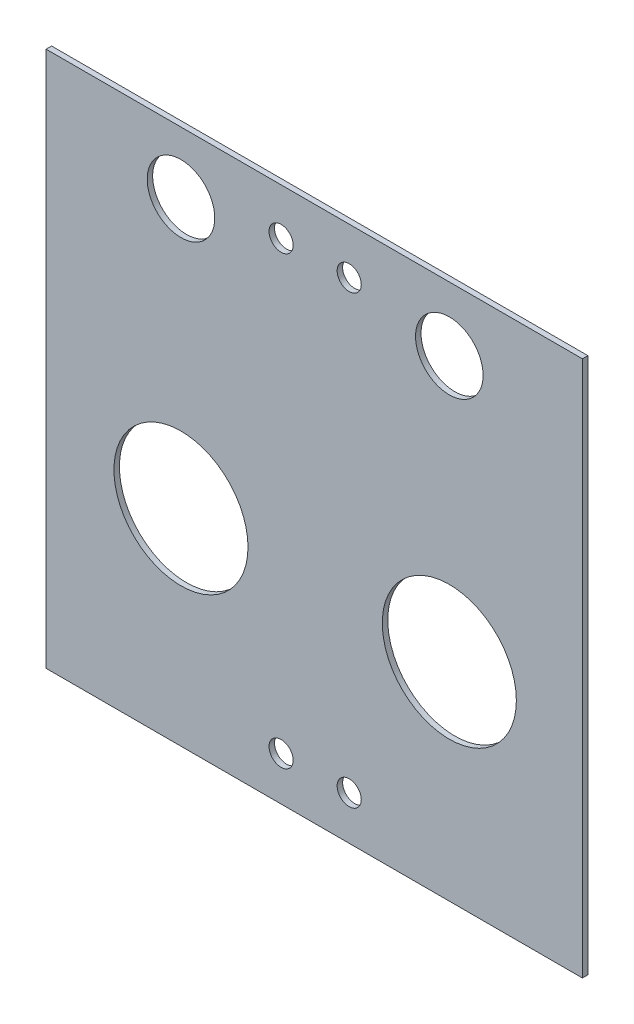
ISO-10303-21;
HEADER;
FILE_DESCRIPTION(('STEP AP214'),'2;1');
FILE_NAME('part.step','',(''),(''),'','','');
FILE_SCHEMA(('AUTOMOTIVE_DESIGN { 1 0 10303 214 1 1 1 1 }'));
ENDSEC;
DATA;
#1=APPLICATION_CONTEXT('core data for automotive mechanical design processes');
#2=APPLICATION_PROTOCOL_DEFINITION('international standard','automotive_design',2000,#1);
#3=PRODUCT_CONTEXT('',#1,'mechanical');
#4=PRODUCT('Part','Part','',(#3));
#5=PRODUCT_RELATED_PRODUCT_CATEGORY('part','',(#4));
#6=PRODUCT_DEFINITION_FORMATION('','',#4);
#7=PRODUCT_DEFINITION_CONTEXT('part definition',#1,'design');
#8=PRODUCT_DEFINITION('design','',#6,#7);
#9=PRODUCT_DEFINITION_SHAPE('','',#8);
#10=(LENGTH_UNIT() NAMED_UNIT(*) SI_UNIT(.MILLI.,.METRE.));
#11=(NAMED_UNIT(*) PLANE_ANGLE_UNIT() SI_UNIT($,.RADIAN.));
#12=(NAMED_UNIT(*) SI_UNIT($,.STERADIAN.) SOLID_ANGLE_UNIT());
#13=UNCERTAINTY_MEASURE_WITH_UNIT(LENGTH_MEASURE(1.E-05),#10,'distance_accuracy_value','');
#14=(GEOMETRIC_REPRESENTATION_CONTEXT(3) GLOBAL_UNCERTAINTY_ASSIGNED_CONTEXT((#13)) GLOBAL_UNIT_ASSIGNED_CONTEXT((#10,
#11,#12)) REPRESENTATION_CONTEXT('',''));
#15=CARTESIAN_POINT('',(0.,0.,0.));
#16=DIRECTION('',(0.,0.,1.));
#17=DIRECTION('',(1.,0.,0.));
#18=AXIS2_PLACEMENT_3D('',#15,#16,#17);
#19=CARTESIAN_POINT('',(127.71099853515,85.258003234863,-0.41148));
#20=DIRECTION('',(0.,0.,1.));
#21=DIRECTION('',(1.,0.,0.));
#22=AXIS2_PLACEMENT_3D('',#19,#20,#21);
#23=PLANE('',#22);
#24=CARTESIAN_POINT('',(142.74800109863,102.87000274658,-0.41148));
#25=DIRECTION('',(0.,0.,1.));
#26=DIRECTION('',(1.,0.,0.));
#27=AXIS2_PLACEMENT_3D('',#24,#25,#26);
#28=CIRCLE('',#27,1.259999990463);
#29=CARTESIAN_POINT('',(144.00800108909,102.87000274658,-0.41148));
#30=VERTEX_POINT('',#29);
#31=EDGE_CURVE('P0_E48',#30,#30,#28,.T.);
#32=ORIENTED_EDGE('',*,*,#31,.T.);
#33=EDGE_LOOP('',(#32));
#34=FACE_BOUND('',#33,.T.);
#35=CARTESIAN_POINT('',(139.014,103.53,-0.41148));
#36=DIRECTION('',(0.,0.,1.));
#37=DIRECTION('',(1.,0.,0.));
#38=AXIS2_PLACEMENT_3D('',#35,#36,#37);
#39=CIRCLE('',#38,0.45);
#40=CARTESIAN_POINT('',(139.464,103.53,-0.41148));
#41=VERTEX_POINT('',#40);
#42=EDGE_CURVE('P0_E177',#41,#41,#39,.T.);
#43=ORIENTED_EDGE('',*,*,#42,.T.);
#44=EDGE_LOOP('',(#43));
#45=FACE_BOUND('',#44,.T.);
#46=CARTESIAN_POINT('',(142.74800109863,92.988998413086,-0.41148));
#47=DIRECTION('',(0.,0.,1.));
#48=DIRECTION('',(1.,0.,0.));
#49=AXIS2_PLACEMENT_3D('',#46,#47,#48);
#50=CIRCLE('',#49,2.5);
#51=CARTESIAN_POINT('',(145.24800109863,92.988998413086,-0.41148));
#52=VERTEX_POINT('',#51);
#53=EDGE_CURVE('P0_E186',#52,#52,#50,.T.);
#54=ORIENTED_EDGE('',*,*,#53,.T.);
#55=EDGE_LOOP('',(#54));
#56=FACE_BOUND('',#55,.T.);
#57=CARTESIAN_POINT('',(139.014,86.893,-0.41148));
#58=DIRECTION('',(0.,0.,1.));
#59=DIRECTION('',(1.,0.,0.));
#60=AXIS2_PLACEMENT_3D('',#57,#58,#59);
#61=CIRCLE('',#60,0.45);
#62=CARTESIAN_POINT('',(139.464,86.893,-0.41148));
#63=VERTEX_POINT('',#62);
#64=EDGE_CURVE('P0_E158',#63,#63,#61,.T.);
#65=ORIENTED_EDGE('',*,*,#64,.T.);
#66=EDGE_LOOP('',(#65));
#67=FACE_BOUND('',#66,.T.);
#68=CARTESIAN_POINT('',(136.474,103.53,-0.41148));
#69=DIRECTION('',(0.,0.,1.));
#70=DIRECTION('',(1.,0.,0.));
#71=AXIS2_PLACEMENT_3D('',#68,#69,#70);
#72=CIRCLE('',#71,0.45);
#73=CARTESIAN_POINT('',(136.924,103.53,-0.41148));
#74=VERTEX_POINT('',#73);
#75=EDGE_CURVE('P0_E159',#74,#74,#72,.T.);
#76=ORIENTED_EDGE('',*,*,#75,.T.);
#77=EDGE_LOOP('',(#76));
#78=FACE_BOUND('',#77,.T.);
#79=CARTESIAN_POINT('',(132.74000549316,102.9459991455,-0.41148));
#80=DIRECTION('',(0.,0.,1.));
#81=DIRECTION('',(1.,0.,0.));
#82=AXIS2_PLACEMENT_3D('',#79,#80,#81);
#83=CIRCLE('',#82,1.259999990463);
#84=CARTESIAN_POINT('',(134.00000548362,102.9459991455,-0.41148));
#85=VERTEX_POINT('',#84);
#86=EDGE_CURVE('P0_E154',#85,#85,#83,.T.);
#87=ORIENTED_EDGE('',*,*,#86,.T.);
#88=EDGE_LOOP('',(#87));
#89=FACE_BOUND('',#88,.T.);
#90=CARTESIAN_POINT('',(136.474,86.893,-0.41148));
#91=DIRECTION('',(0.,0.,1.));
#92=DIRECTION('',(1.,0.,0.));
#93=AXIS2_PLACEMENT_3D('',#90,#91,#92);
#94=CIRCLE('',#93,0.45);
#95=CARTESIAN_POINT('',(136.924,86.893,-0.41148));
#96=VERTEX_POINT('',#95);
#97=EDGE_CURVE('P0_E184',#96,#96,#94,.T.);
#98=ORIENTED_EDGE('',*,*,#97,.T.);
#99=EDGE_LOOP('',(#98));
#100=FACE_BOUND('',#99,.T.);
#101=CARTESIAN_POINT('',(132.74000549316,92.939002990723,-0.41148));
#102=DIRECTION('',(0.,0.,1.));
#103=DIRECTION('',(1.,0.,0.));
#104=AXIS2_PLACEMENT_3D('',#101,#102,#103);
#105=CIRCLE('',#104,2.5);
#106=CARTESIAN_POINT('',(135.24000549316,92.939002990723,-0.41148));
#107=VERTEX_POINT('',#106);
#108=EDGE_CURVE('P0_E200',#107,#107,#105,.T.);
#109=ORIENTED_EDGE('',*,*,#108,.T.);
#110=EDGE_LOOP('',(#109));
#111=FACE_BOUND('',#110,.T.);
#112=DIRECTION('',(0.,1.,0.));
#113=VECTOR('',#112,1.);
#114=CARTESIAN_POINT('',(127.71099853515,85.258003234863,-0.41148));
#115=LINE('',#114,#113);
#116=CARTESIAN_POINT('',(127.71099853515,85.258003234863,-0.41148));
#117=VERTEX_POINT('',#116);
#118=CARTESIAN_POINT('',(127.71099853515,105.25800323486,-0.41148));
#119=VERTEX_POINT('',#118);
#120=EDGE_CURVE('P0_E148',#117,#119,#115,.T.);
#121=ORIENTED_EDGE('',*,*,#120,.T.);
#122=DIRECTION('',(1.,0.,0.));
#123=VECTOR('',#122,1.);
#124=CARTESIAN_POINT('',(127.71099853515,105.25800323486,-0.41148));
#125=LINE('',#124,#123);
#126=CARTESIAN_POINT('',(147.71099853515,105.25800323486,-0.41148));
#127=VERTEX_POINT('',#126);
#128=EDGE_CURVE('P0_E194',#119,#127,#125,.T.);
#129=ORIENTED_EDGE('',*,*,#128,.T.);
#130=DIRECTION('',(0.,-1.,0.));
#131=VECTOR('',#130,1.);
#132=CARTESIAN_POINT('',(147.71099853515,105.25800323486,-0.41148));
#133=LINE('',#132,#131);
#134=CARTESIAN_POINT('',(147.71099853515,85.258003234863,-0.41148));
#135=VERTEX_POINT('',#134);
#136=EDGE_CURVE('P0_E181',#127,#135,#133,.T.);
#137=ORIENTED_EDGE('',*,*,#136,.T.);
#138=DIRECTION('',(-1.,0.,0.));
#139=VECTOR('',#138,1.);
#140=CARTESIAN_POINT('',(147.71099853515,85.258003234863,-0.41148));
#141=LINE('',#140,#139);
#142=EDGE_CURVE('P0_E178',#135,#117,#141,.T.);
#143=ORIENTED_EDGE('',*,*,#142,.T.);
#144=EDGE_LOOP('',(#121,#129,#137,#143));
#145=FACE_BOUND('',#144,.T.);
#146=ADVANCED_FACE('P0_F40',(#34,#45,#56,#67,#78,#89,#100,#111,#145),#23,.F.);
#147=CARTESIAN_POINT('',(142.74800109863,102.87000274658,-0.41148));
#148=DIRECTION('',(0.,0.,-1.));
#149=DIRECTION('',(1.,0.,0.));
#150=AXIS2_PLACEMENT_3D('',#147,#148,#149);
#151=CYLINDRICAL_SURFACE('',#150,1.259999990463);
#152=DIRECTION('',(0.,0.,1.));
#153=VECTOR('',#152,1.);
#154=CARTESIAN_POINT('',(144.00800108909,102.87000274658,-0.41148));
#155=LINE('',#154,#153);
#156=CARTESIAN_POINT('',(144.00800108909,102.87000274658,-0.207080099511654));
#157=VERTEX_POINT('',#156);
#158=EDGE_CURVE('P0_E174',#30,#157,#155,.T.);
#159=ORIENTED_EDGE('',*,*,#158,.T.);
#160=CARTESIAN_POINT('',(142.74800109863,102.87000274658,-0.207080099511654));
#161=DIRECTION('',(0.,0.,-1.));
#162=DIRECTION('',(0.,1.,0.));
#163=AXIS2_PLACEMENT_3D('',#160,#161,#162);
#164=CIRCLE('',#163,1.259999990463);
#165=EDGE_CURVE('P0_E53',#157,#157,#164,.F.);
#166=ORIENTED_EDGE('',*,*,#165,.T.);
#167=ORIENTED_EDGE('',*,*,#158,.F.);
#168=ORIENTED_EDGE('',*,*,#31,.F.);
#169=EDGE_LOOP('',(#159,#166,#167,#168));
#170=FACE_BOUND('',#169,.T.);
#171=ADVANCED_FACE('P0_F241',(#170),#151,.F.);
#172=CARTESIAN_POINT('',(139.014,103.53,-0.41148));
#173=DIRECTION('',(0.,0.,-1.));
#174=DIRECTION('',(1.,0.,0.));
#175=AXIS2_PLACEMENT_3D('',#172,#173,#174);
#176=CYLINDRICAL_SURFACE('',#175,0.45);
#177=DIRECTION('',(0.,0.,1.));
#178=VECTOR('',#177,1.);
#179=CARTESIAN_POINT('',(139.464,103.53,-0.41148));
#180=LINE('',#179,#178);
#181=CARTESIAN_POINT('',(139.464,103.53,-0.207080099511654));
#182=VERTEX_POINT('',#181);
#183=EDGE_CURVE('P0_E188',#41,#182,#180,.T.);
#184=ORIENTED_EDGE('',*,*,#183,.T.);
#185=CARTESIAN_POINT('',(139.014,103.53,-0.207080099511654));
#186=DIRECTION('',(0.,0.,-1.));
#187=DIRECTION('',(0.,1.,0.));
#188=AXIS2_PLACEMENT_3D('',#185,#186,#187);
#189=CIRCLE('',#188,0.45);
#190=EDGE_CURVE('P0_E58',#182,#182,#189,.F.);
#191=ORIENTED_EDGE('',*,*,#190,.T.);
#192=ORIENTED_EDGE('',*,*,#183,.F.);
#193=ORIENTED_EDGE('',*,*,#42,.F.);
#194=EDGE_LOOP('',(#184,#191,#192,#193));
#195=FACE_BOUND('',#194,.T.);
#196=ADVANCED_FACE('P0_F247',(#195),#176,.F.);
#197=CARTESIAN_POINT('',(142.74800109863,92.988998413086,-0.41148));
#198=DIRECTION('',(0.,0.,-1.));
#199=DIRECTION('',(1.,0.,0.));
#200=AXIS2_PLACEMENT_3D('',#197,#198,#199);
#201=CYLINDRICAL_SURFACE('',#200,2.5);
#202=DIRECTION('',(0.,0.,1.));
#203=VECTOR('',#202,1.);
#204=CARTESIAN_POINT('',(145.24800109863,92.988998413086,-0.41148));
#205=LINE('',#204,#203);
#206=CARTESIAN_POINT('',(145.24800109863,92.988998413086,-0.207080099511653));
#207=VERTEX_POINT('',#206);
#208=EDGE_CURVE('P0_E164',#52,#207,#205,.T.);
#209=ORIENTED_EDGE('',*,*,#208,.T.);
#210=CARTESIAN_POINT('',(142.74800109863,92.988998413086,-0.207080099511653));
#211=DIRECTION('',(0.,0.,-1.));
#212=DIRECTION('',(0.,1.,0.));
#213=AXIS2_PLACEMENT_3D('',#210,#211,#212);
#214=CIRCLE('',#213,2.5);
#215=EDGE_CURVE('P0_E216',#207,#207,#214,.F.);
#216=ORIENTED_EDGE('',*,*,#215,.T.);
#217=ORIENTED_EDGE('',*,*,#208,.F.);
#218=ORIENTED_EDGE('',*,*,#53,.F.);
#219=EDGE_LOOP('',(#209,#216,#217,#218));
#220=FACE_BOUND('',#219,.T.);
#221=ADVANCED_FACE('P0_F42',(#220),#201,.F.);
#222=CARTESIAN_POINT('',(139.014,86.893,-0.41148));
#223=DIRECTION('',(0.,0.,-1.));
#224=DIRECTION('',(1.,0.,0.));
#225=AXIS2_PLACEMENT_3D('',#222,#223,#224);
#226=CYLINDRICAL_SURFACE('',#225,0.45);
#227=DIRECTION('',(0.,0.,1.));
#228=VECTOR('',#227,1.);
#229=CARTESIAN_POINT('',(139.464,86.893,-0.41148));
#230=LINE('',#229,#228);
#231=CARTESIAN_POINT('',(139.464,86.893,-0.207080099511652));
#232=VERTEX_POINT('',#231);
#233=EDGE_CURVE('P0_E156',#63,#232,#230,.T.);
#234=ORIENTED_EDGE('',*,*,#233,.T.);
#235=CARTESIAN_POINT('',(139.014,86.893,-0.207080099511652));
#236=DIRECTION('',(0.,0.,-1.));
#237=DIRECTION('',(0.,1.,0.));
#238=AXIS2_PLACEMENT_3D('',#235,#236,#237);
#239=CIRCLE('',#238,0.45);
#240=EDGE_CURVE('P0_E219',#232,#232,#239,.F.);
#241=ORIENTED_EDGE('',*,*,#240,.T.);
#242=ORIENTED_EDGE('',*,*,#233,.F.);
#243=ORIENTED_EDGE('',*,*,#64,.F.);
#244=EDGE_LOOP('',(#234,#241,#242,#243));
#245=FACE_BOUND('',#244,.T.);
#246=ADVANCED_FACE('P0_F251',(#245),#226,.F.);
#247=CARTESIAN_POINT('',(136.474,103.53,-0.41148));
#248=DIRECTION('',(0.,0.,-1.));
#249=DIRECTION('',(1.,0.,0.));
#250=AXIS2_PLACEMENT_3D('',#247,#248,#249);
#251=CYLINDRICAL_SURFACE('',#250,0.45);
#252=DIRECTION('',(0.,0.,1.));
#253=VECTOR('',#252,1.);
#254=CARTESIAN_POINT('',(136.924,103.53,-0.41148));
#255=LINE('',#254,#253);
#256=CARTESIAN_POINT('',(136.924,103.53,-0.207080099511654));
#257=VERTEX_POINT('',#256);
#258=EDGE_CURVE('P0_E166',#74,#257,#255,.T.);
#259=ORIENTED_EDGE('',*,*,#258,.T.);
#260=CARTESIAN_POINT('',(136.474,103.53,-0.207080099511654));
#261=DIRECTION('',(0.,0.,-1.));
#262=DIRECTION('',(0.,1.,0.));
#263=AXIS2_PLACEMENT_3D('',#260,#261,#262);
#264=CIRCLE('',#263,0.45);
#265=EDGE_CURVE('P0_E221',#257,#257,#264,.F.);
#266=ORIENTED_EDGE('',*,*,#265,.T.);
#267=ORIENTED_EDGE('',*,*,#258,.F.);
#268=ORIENTED_EDGE('',*,*,#75,.F.);
#269=EDGE_LOOP('',(#259,#266,#267,#268));
#270=FACE_BOUND('',#269,.T.);
#271=ADVANCED_FACE('P0_F264',(#270),#251,.F.);
#272=CARTESIAN_POINT('',(132.74000549316,102.9459991455,-0.41148));
#273=DIRECTION('',(0.,0.,-1.));
#274=DIRECTION('',(1.,0.,0.));
#275=AXIS2_PLACEMENT_3D('',#272,#273,#274);
#276=CYLINDRICAL_SURFACE('',#275,1.259999990463);
#277=DIRECTION('',(0.,0.,1.));
#278=VECTOR('',#277,1.);
#279=CARTESIAN_POINT('',(134.00000548362,102.9459991455,-0.41148));
#280=LINE('',#279,#278);
#281=CARTESIAN_POINT('',(134.00000548362,102.9459991455,-0.207080099511654));
#282=VERTEX_POINT('',#281);
#283=EDGE_CURVE('P0_E182',#85,#282,#280,.T.);
#284=ORIENTED_EDGE('',*,*,#283,.T.);
#285=CARTESIAN_POINT('',(132.74000549316,102.9459991455,-0.207080099511654));
#286=DIRECTION('',(0.,0.,-1.));
#287=DIRECTION('',(0.,1.,0.));
#288=AXIS2_PLACEMENT_3D('',#285,#286,#287);
#289=CIRCLE('',#288,1.259999990463);
#290=EDGE_CURVE('P0_E224',#282,#282,#289,.F.);
#291=ORIENTED_EDGE('',*,*,#290,.T.);
#292=ORIENTED_EDGE('',*,*,#283,.F.);
#293=ORIENTED_EDGE('',*,*,#86,.F.);
#294=EDGE_LOOP('',(#284,#291,#292,#293));
#295=FACE_BOUND('',#294,.T.);
#296=ADVANCED_FACE('P0_F256',(#295),#276,.F.);
#297=CARTESIAN_POINT('',(136.474,86.893,-0.41148));
#298=DIRECTION('',(0.,0.,-1.));
#299=DIRECTION('',(1.,0.,0.));
#300=AXIS2_PLACEMENT_3D('',#297,#298,#299);
#301=CYLINDRICAL_SURFACE('',#300,0.45);
#302=DIRECTION('',(0.,0.,1.));
#303=VECTOR('',#302,1.);
#304=CARTESIAN_POINT('',(136.924,86.893,-0.41148));
#305=LINE('',#304,#303);
#306=CARTESIAN_POINT('',(136.924,86.893,-0.207080099511652));
#307=VERTEX_POINT('',#306);
#308=EDGE_CURVE('P0_E190',#96,#307,#305,.T.);
#309=ORIENTED_EDGE('',*,*,#308,.T.);
#310=CARTESIAN_POINT('',(136.474,86.893,-0.207080099511652));
#311=DIRECTION('',(0.,0.,-1.));
#312=DIRECTION('',(0.,1.,0.));
#313=AXIS2_PLACEMENT_3D('',#310,#311,#312);
#314=CIRCLE('',#313,0.45);
#315=EDGE_CURVE('P0_E227',#307,#307,#314,.F.);
#316=ORIENTED_EDGE('',*,*,#315,.T.);
#317=ORIENTED_EDGE('',*,*,#308,.F.);
#318=ORIENTED_EDGE('',*,*,#97,.F.);
#319=EDGE_LOOP('',(#309,#316,#317,#318));
#320=FACE_BOUND('',#319,.T.);
#321=ADVANCED_FACE('P0_F253',(#320),#301,.F.);
#322=CARTESIAN_POINT('',(132.74000549316,92.939002990723,-0.41148));
#323=DIRECTION('',(0.,0.,-1.));
#324=DIRECTION('',(1.,0.,0.));
#325=AXIS2_PLACEMENT_3D('',#322,#323,#324);
#326=CYLINDRICAL_SURFACE('',#325,2.5);
#327=DIRECTION('',(0.,0.,1.));
#328=VECTOR('',#327,1.);
#329=CARTESIAN_POINT('',(135.24000549316,92.939002990723,-0.41148));
#330=LINE('',#329,#328);
#331=CARTESIAN_POINT('',(135.24000549316,92.939002990723,-0.207080099511653));
#332=VERTEX_POINT('',#331);
#333=EDGE_CURVE('P0_E180',#107,#332,#330,.T.);
#334=ORIENTED_EDGE('',*,*,#333,.T.);
#335=CARTESIAN_POINT('',(132.74000549316,92.939002990723,-0.207080099511653));
#336=DIRECTION('',(0.,0.,-1.));
#337=DIRECTION('',(0.,1.,0.));
#338=AXIS2_PLACEMENT_3D('',#335,#336,#337);
#339=CIRCLE('',#338,2.5);
#340=EDGE_CURVE('P0_E143',#332,#332,#339,.F.);
#341=ORIENTED_EDGE('',*,*,#340,.T.);
#342=ORIENTED_EDGE('',*,*,#333,.F.);
#343=ORIENTED_EDGE('',*,*,#108,.F.);
#344=EDGE_LOOP('',(#334,#341,#342,#343));
#345=FACE_BOUND('',#344,.T.);
#346=ADVANCED_FACE('P0_F255',(#345),#326,.F.);
#347=CARTESIAN_POINT('',(147.71099853515,85.258003234863,-0.41148));
#348=DIRECTION('',(0.,-1.,0.));
#349=DIRECTION('',(0.,0.,-1.));
#350=AXIS2_PLACEMENT_3D('',#347,#348,#349);
#351=PLANE('',#350);
#352=DIRECTION('',(1.,0.,0.));
#353=VECTOR('',#352,1.);
#354=CARTESIAN_POINT('',(147.71099853515,85.258003234863,-0.207080099511652));
#355=LINE('',#354,#353);
#356=CARTESIAN_POINT('',(127.71099853515,85.258003234863,-0.207080099511652));
#357=VERTEX_POINT('',#356);
#358=CARTESIAN_POINT('',(147.71099853515,85.258003234863,-0.207080099511652));
#359=VERTEX_POINT('',#358);
#360=EDGE_CURVE('P0_E128',#357,#359,#355,.T.);
#361=ORIENTED_EDGE('',*,*,#360,.F.);
#362=DIRECTION('',(0.,0.,1.));
#363=VECTOR('',#362,1.);
#364=CARTESIAN_POINT('',(127.71099853515,85.258003234863,-0.41148));
#365=LINE('',#364,#363);
#366=EDGE_CURVE('P0_E140',#117,#357,#365,.T.);
#367=ORIENTED_EDGE('',*,*,#366,.F.);
#368=ORIENTED_EDGE('',*,*,#142,.F.);
#369=DIRECTION('',(0.,0.,1.));
#370=VECTOR('',#369,1.);
#371=CARTESIAN_POINT('',(147.71099853515,85.258003234863,-0.41148));
#372=LINE('',#371,#370);
#373=EDGE_CURVE('P0_E142',#135,#359,#372,.T.);
#374=ORIENTED_EDGE('',*,*,#373,.T.);
#375=EDGE_LOOP('',(#361,#367,#368,#374));
#376=FACE_BOUND('',#375,.T.);
#377=ADVANCED_FACE('P0_F139',(#376),#351,.T.);
#378=CARTESIAN_POINT('',(147.71099853515,105.25800323486,-0.41148));
#379=DIRECTION('',(1.,0.,0.));
#380=DIRECTION('',(0.,1.,0.));
#381=AXIS2_PLACEMENT_3D('',#378,#379,#380);
#382=PLANE('',#381);
#383=DIRECTION('',(0.,-1.,0.));
#384=VECTOR('',#383,1.);
#385=CARTESIAN_POINT('',(147.71099853515,105.843054588101,-0.207080099511654));
#386=LINE('',#385,#384);
#387=CARTESIAN_POINT('',(147.71099853515,105.25800323486,-0.207080099511654));
#388=VERTEX_POINT('',#387);
#389=EDGE_CURVE('P0_E233',#388,#359,#386,.T.);
#390=ORIENTED_EDGE('',*,*,#389,.T.);
#391=ORIENTED_EDGE('',*,*,#373,.F.);
#392=ORIENTED_EDGE('',*,*,#136,.F.);
#393=DIRECTION('',(0.,0.,1.));
#394=VECTOR('',#393,1.);
#395=CARTESIAN_POINT('',(147.71099853515,105.25800323486,-0.41148));
#396=LINE('',#395,#394);
#397=EDGE_CURVE('P0_E191',#127,#388,#396,.T.);
#398=ORIENTED_EDGE('',*,*,#397,.T.);
#399=EDGE_LOOP('',(#390,#391,#392,#398));
#400=FACE_BOUND('',#399,.T.);
#401=ADVANCED_FACE('P0_F235',(#400),#382,.T.);
#402=CARTESIAN_POINT('',(127.71099853515,105.25800323486,-0.41148));
#403=DIRECTION('',(0.,1.,0.));
#404=DIRECTION('',(1.,0.,0.));
#405=AXIS2_PLACEMENT_3D('',#402,#403,#404);
#406=PLANE('',#405);
#407=DIRECTION('',(-1.,0.,0.));
#408=VECTOR('',#407,1.);
#409=CARTESIAN_POINT('',(127.71099853515,105.25800323486,-0.207080099511654));
#410=LINE('',#409,#408);
#411=CARTESIAN_POINT('',(127.71099853515,105.25800323486,-0.207080099511653));
#412=VERTEX_POINT('',#411);
#413=EDGE_CURVE('P0_E131',#388,#412,#410,.T.);
#414=ORIENTED_EDGE('',*,*,#413,.F.);
#415=ORIENTED_EDGE('',*,*,#397,.F.);
#416=ORIENTED_EDGE('',*,*,#128,.F.);
#417=DIRECTION('',(0.,0.,1.));
#418=VECTOR('',#417,1.);
#419=CARTESIAN_POINT('',(127.71099853515,105.25800323486,-0.41148));
#420=LINE('',#419,#418);
#421=EDGE_CURVE('P0_E149',#119,#412,#420,.T.);
#422=ORIENTED_EDGE('',*,*,#421,.T.);
#423=EDGE_LOOP('',(#414,#415,#416,#422));
#424=FACE_BOUND('',#423,.T.);
#425=ADVANCED_FACE('P0_F238',(#424),#406,.T.);
#426=CARTESIAN_POINT('',(127.71099853515,85.258003234863,-0.41148));
#427=DIRECTION('',(-1.,0.,0.));
#428=DIRECTION('',(0.,0.,1.));
#429=AXIS2_PLACEMENT_3D('',#426,#427,#428);
#430=PLANE('',#429);
#431=DIRECTION('',(0.,-1.,0.));
#432=VECTOR('',#431,1.);
#433=CARTESIAN_POINT('',(127.71099853515,85.258003234863,-0.207080099511652));
#434=LINE('',#433,#432);
#435=EDGE_CURVE('P0_E11',#412,#357,#434,.T.);
#436=ORIENTED_EDGE('',*,*,#435,.F.);
#437=ORIENTED_EDGE('',*,*,#421,.F.);
#438=ORIENTED_EDGE('',*,*,#120,.F.);
#439=ORIENTED_EDGE('',*,*,#366,.T.);
#440=EDGE_LOOP('',(#436,#437,#438,#439));
#441=FACE_BOUND('',#440,.T.);
#442=ADVANCED_FACE('P0_F146',(#441),#430,.T.);
#443=CARTESIAN_POINT('',(147.71099853515,105.843054588101,-0.207080099511654));
#444=DIRECTION('',(0.,0.,-1.));
#445=DIRECTION('',(0.,1.,0.));
#446=AXIS2_PLACEMENT_3D('',#443,#444,#445);
#447=PLANE('',#446);
#448=ORIENTED_EDGE('',*,*,#360,.T.);
#449=ORIENTED_EDGE('',*,*,#389,.F.);
#450=ORIENTED_EDGE('',*,*,#413,.T.);
#451=ORIENTED_EDGE('',*,*,#435,.T.);
#452=EDGE_LOOP('',(#448,#449,#450,#451));
#453=FACE_BOUND('',#452,.T.);
#454=ORIENTED_EDGE('',*,*,#340,.F.);
#455=EDGE_LOOP('',(#454));
#456=FACE_BOUND('',#455,.T.);
#457=ORIENTED_EDGE('',*,*,#315,.F.);
#458=EDGE_LOOP('',(#457));
#459=FACE_BOUND('',#458,.T.);
#460=ORIENTED_EDGE('',*,*,#290,.F.);
#461=EDGE_LOOP('',(#460));
#462=FACE_BOUND('',#461,.T.);
#463=ORIENTED_EDGE('',*,*,#265,.F.);
#464=EDGE_LOOP('',(#463));
#465=FACE_BOUND('',#464,.T.);
#466=ORIENTED_EDGE('',*,*,#240,.F.);
#467=EDGE_LOOP('',(#466));
#468=FACE_BOUND('',#467,.T.);
#469=ORIENTED_EDGE('',*,*,#215,.F.);
#470=EDGE_LOOP('',(#469));
#471=FACE_BOUND('',#470,.T.);
#472=ORIENTED_EDGE('',*,*,#190,.F.);
#473=EDGE_LOOP('',(#472));
#474=FACE_BOUND('',#473,.T.);
#475=ORIENTED_EDGE('',*,*,#165,.F.);
#476=EDGE_LOOP('',(#475));
#477=FACE_BOUND('',#476,.T.);
#478=ADVANCED_FACE('P0_F126',(#453,#456,#459,#462,#465,#468,#471,#474,#477),#447,.F.);
#479=CLOSED_SHELL('',(#146,#171,#196,#221,#246,#271,#296,#321,#346,#377,#401,#425,#442,#478));
#480=MANIFOLD_SOLID_BREP('P0_B2',#479);
#481=CARTESIAN_POINT('',(136.55040185546,99.288598266602,-0.481481647012));
#482=DIRECTION('',(0.,0.,1.));
#483=DIRECTION('',(1.,0.,0.));
#484=AXIS2_PLACEMENT_3D('',#481,#482,#483);
#485=PLANE('',#484);
#486=DIRECTION('',(0.,1.,0.));
#487=VECTOR('',#486,1.);
#488=CARTESIAN_POINT('',(136.55040185546,97.256598266602,-0.481481647012));
#489=LINE('',#488,#487);
#490=CARTESIAN_POINT('',(136.55040185546,97.256598266602,-0.481481647012));
#491=VERTEX_POINT('',#490);
#492=CARTESIAN_POINT('',(136.55040185546,99.288598266602,-0.481481647012));
#493=VERTEX_POINT('',#492);
#494=EDGE_CURVE('P1_E26',#491,#493,#489,.T.);
#495=ORIENTED_EDGE('',*,*,#494,.F.);
#496=DIRECTION('',(-1.,0.,0.));
#497=VECTOR('',#496,1.);
#498=CARTESIAN_POINT('',(139.59840185546,97.256598266602,-0.481481647012));
#499=LINE('',#498,#497);
#500=CARTESIAN_POINT('',(139.59840185546,97.256598266602,-0.481481647012));
#501=VERTEX_POINT('',#500);
#502=EDGE_CURVE('P1_E55',#501,#491,#499,.T.);
#503=ORIENTED_EDGE('',*,*,#502,.F.);
#504=DIRECTION('',(0.,-1.,0.));
#505=VECTOR('',#504,1.);
#506=CARTESIAN_POINT('',(139.59840185546,99.288598266602,-0.481481647012));
#507=LINE('',#506,#505);
#508=CARTESIAN_POINT('',(139.59840185546,99.288598266602,-0.481481647012));
#509=VERTEX_POINT('',#508);
#510=EDGE_CURVE('P1_E86',#509,#501,#507,.T.);
#511=ORIENTED_EDGE('',*,*,#510,.F.);
#512=DIRECTION('',(1.,0.,0.));
#513=VECTOR('',#512,1.);
#514=CARTESIAN_POINT('',(136.55040185546,99.288598266602,-0.481481647012));
#515=LINE('',#514,#513);
#516=EDGE_CURVE('P1_E19',#493,#509,#515,.T.);
#517=ORIENTED_EDGE('',*,*,#516,.F.);
#518=EDGE_LOOP('',(#495,#503,#511,#517));
#519=FACE_BOUND('',#518,.T.);
#520=ADVANCED_FACE('P1_F16',(#519),#485,.T.);
#521=CARTESIAN_POINT('',(136.55040185546,99.288598266602,-1.711479187012));
#522=DIRECTION('',(0.,0.,1.));
#523=DIRECTION('',(1.,0.,0.));
#524=AXIS2_PLACEMENT_3D('',#521,#522,#523);
#525=PLANE('',#524);
#526=DIRECTION('',(1.,0.,0.));
#527=VECTOR('',#526,1.);
#528=CARTESIAN_POINT('',(136.55040185546,99.288598266602,-1.711479187012));
#529=LINE('',#528,#527);
#530=CARTESIAN_POINT('',(136.55040185546,99.288598266602,-1.711479187012));
#531=VERTEX_POINT('',#530);
#532=CARTESIAN_POINT('',(139.59840185546,99.288598266602,-1.711479187012));
#533=VERTEX_POINT('',#532);
#534=EDGE_CURVE('P1_E93',#531,#533,#529,.T.);
#535=ORIENTED_EDGE('',*,*,#534,.T.);
#536=DIRECTION('',(0.,-1.,0.));
#537=VECTOR('',#536,1.);
#538=CARTESIAN_POINT('',(139.59840185546,99.288598266602,-1.711479187012));
#539=LINE('',#538,#537);
#540=CARTESIAN_POINT('',(139.59840185546,97.256598266602,-1.711479187012));
#541=VERTEX_POINT('',#540);
#542=EDGE_CURVE('P1_E69',#533,#541,#539,.T.);
#543=ORIENTED_EDGE('',*,*,#542,.T.);
#544=DIRECTION('',(-1.,0.,0.));
#545=VECTOR('',#544,1.);
#546=CARTESIAN_POINT('',(139.59840185546,97.256598266602,-1.711479187012));
#547=LINE('',#546,#545);
#548=CARTESIAN_POINT('',(136.55040185546,97.256598266602,-1.711479187012));
#549=VERTEX_POINT('',#548);
#550=EDGE_CURVE('P1_E82',#541,#549,#547,.T.);
#551=ORIENTED_EDGE('',*,*,#550,.T.);
#552=DIRECTION('',(0.,1.,0.));
#553=VECTOR('',#552,1.);
#554=CARTESIAN_POINT('',(136.55040185546,97.256598266602,-1.711479187012));
#555=LINE('',#554,#553);
#556=EDGE_CURVE('P1_E11',#549,#531,#555,.T.);
#557=ORIENTED_EDGE('',*,*,#556,.T.);
#558=EDGE_LOOP('',(#535,#543,#551,#557));
#559=FACE_BOUND('',#558,.T.);
#560=ADVANCED_FACE('P1_F114',(#559),#525,.F.);
#561=CARTESIAN_POINT('',(136.55040185546,97.256598266602,-1.711479187012));
#562=DIRECTION('',(-1.,0.,0.));
#563=DIRECTION('',(0.,0.,1.));
#564=AXIS2_PLACEMENT_3D('',#561,#562,#563);
#565=PLANE('',#564);
#566=DIRECTION('',(0.,0.,1.));
#567=VECTOR('',#566,1.);
#568=CARTESIAN_POINT('',(136.55040185546,97.256598266602,-1.711479187012));
#569=LINE('',#568,#567);
#570=EDGE_CURVE('P1_E80',#549,#491,#569,.T.);
#571=ORIENTED_EDGE('',*,*,#570,.T.);
#572=ORIENTED_EDGE('',*,*,#494,.T.);
#573=DIRECTION('',(0.,0.,1.));
#574=VECTOR('',#573,1.);
#575=CARTESIAN_POINT('',(136.55040185546,99.288598266602,-1.711479187012));
#576=LINE('',#575,#574);
#577=EDGE_CURVE('P1_E78',#531,#493,#576,.T.);
#578=ORIENTED_EDGE('',*,*,#577,.F.);
#579=ORIENTED_EDGE('',*,*,#556,.F.);
#580=EDGE_LOOP('',(#571,#572,#578,#579));
#581=FACE_BOUND('',#580,.T.);
#582=ADVANCED_FACE('P1_F76',(#581),#565,.T.);
#583=CARTESIAN_POINT('',(139.59840185546,97.256598266602,-1.711479187012));
#584=DIRECTION('',(0.,-1.,0.));
#585=DIRECTION('',(0.,0.,-1.));
#586=AXIS2_PLACEMENT_3D('',#583,#584,#585);
#587=PLANE('',#586);
#588=DIRECTION('',(0.,0.,1.));
#589=VECTOR('',#588,1.);
#590=CARTESIAN_POINT('',(139.59840185546,97.256598266602,-1.711479187012));
#591=LINE('',#590,#589);
#592=EDGE_CURVE('P1_E101',#541,#501,#591,.T.);
#593=ORIENTED_EDGE('',*,*,#592,.T.);
#594=ORIENTED_EDGE('',*,*,#502,.T.);
#595=ORIENTED_EDGE('',*,*,#570,.F.);
#596=ORIENTED_EDGE('',*,*,#550,.F.);
#597=EDGE_LOOP('',(#593,#594,#595,#596));
#598=FACE_BOUND('',#597,.T.);
#599=ADVANCED_FACE('P1_F122',(#598),#587,.T.);
#600=CARTESIAN_POINT('',(139.59840185546,99.288598266602,-1.711479187012));
#601=DIRECTION('',(1.,0.,0.));
#602=DIRECTION('',(0.,1.,0.));
#603=AXIS2_PLACEMENT_3D('',#600,#601,#602);
#604=PLANE('',#603);
#605=DIRECTION('',(0.,0.,1.));
#606=VECTOR('',#605,1.);
#607=CARTESIAN_POINT('',(139.59840185546,99.288598266602,-1.711479187012));
#608=LINE('',#607,#606);
#609=EDGE_CURVE('P1_E90',#533,#509,#608,.T.);
#610=ORIENTED_EDGE('',*,*,#609,.T.);
#611=ORIENTED_EDGE('',*,*,#510,.T.);
#612=ORIENTED_EDGE('',*,*,#592,.F.);
#613=ORIENTED_EDGE('',*,*,#542,.F.);
#614=EDGE_LOOP('',(#610,#611,#612,#613));
#615=FACE_BOUND('',#614,.T.);
#616=ADVANCED_FACE('P1_F115',(#615),#604,.T.);
#617=CARTESIAN_POINT('',(136.55040185546,99.288598266602,-1.711479187012));
#618=DIRECTION('',(0.,1.,0.));
#619=DIRECTION('',(1.,0.,0.));
#620=AXIS2_PLACEMENT_3D('',#617,#618,#619);
#621=PLANE('',#620);
#622=ORIENTED_EDGE('',*,*,#577,.T.);
#623=ORIENTED_EDGE('',*,*,#516,.T.);
#624=ORIENTED_EDGE('',*,*,#609,.F.);
#625=ORIENTED_EDGE('',*,*,#534,.F.);
#626=EDGE_LOOP('',(#622,#623,#624,#625));
#627=FACE_BOUND('',#626,.T.);
#628=ADVANCED_FACE('P1_F92',(#627),#621,.T.);
#629=CLOSED_SHELL('',(#520,#560,#582,#599,#616,#628));
#630=MANIFOLD_SOLID_BREP('P1_B1',#629);
#631=ADVANCED_BREP_SHAPE_REPRESENTATION('',(#18,#480,#630),#14);
#632=SHAPE_DEFINITION_REPRESENTATION(#9,#631);
ENDSEC;
END-ISO-10303-21;
